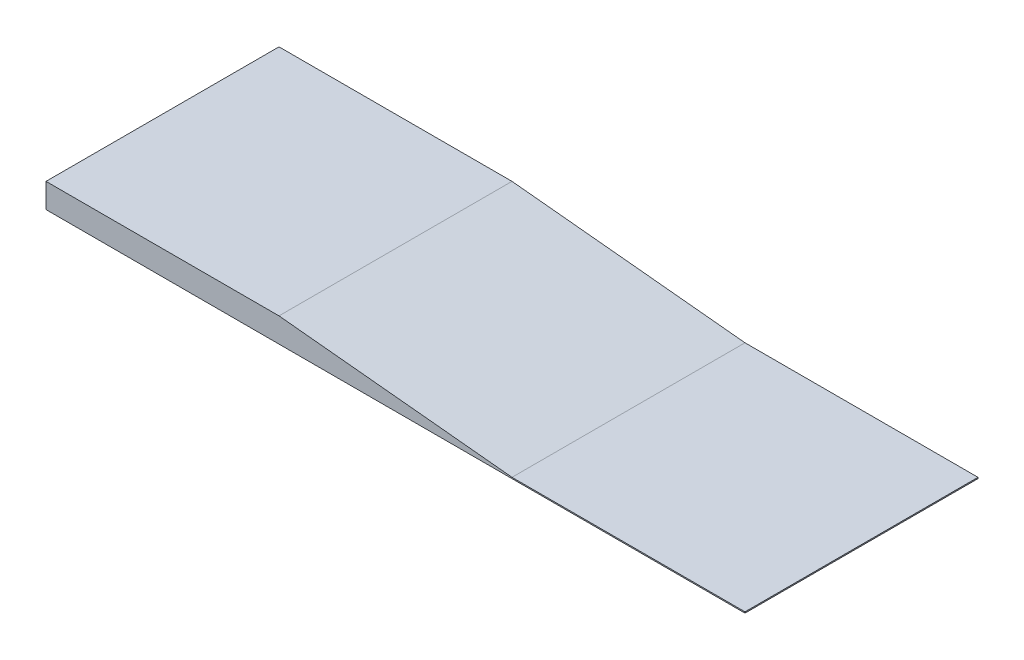
ISO-10303-21;
HEADER;
FILE_DESCRIPTION(('STEP AP214'),'2;1');
FILE_NAME('part.step','',(''),(''),'','','');
FILE_SCHEMA(('AUTOMOTIVE_DESIGN { 1 0 10303 214 1 1 1 1 }'));
ENDSEC;
DATA;
#1=APPLICATION_CONTEXT('core data for automotive mechanical design processes');
#2=APPLICATION_PROTOCOL_DEFINITION('international standard','automotive_design',2000,#1);
#3=PRODUCT_CONTEXT('',#1,'mechanical');
#4=PRODUCT('Part','Part','',(#3));
#5=PRODUCT_RELATED_PRODUCT_CATEGORY('part','',(#4));
#6=PRODUCT_DEFINITION_FORMATION('','',#4);
#7=PRODUCT_DEFINITION_CONTEXT('part definition',#1,'design');
#8=PRODUCT_DEFINITION('design','',#6,#7);
#9=PRODUCT_DEFINITION_SHAPE('','',#8);
#10=(LENGTH_UNIT() NAMED_UNIT(*) SI_UNIT(.MILLI.,.METRE.));
#11=(NAMED_UNIT(*) PLANE_ANGLE_UNIT() SI_UNIT($,.RADIAN.));
#12=(NAMED_UNIT(*) SI_UNIT($,.STERADIAN.) SOLID_ANGLE_UNIT());
#13=UNCERTAINTY_MEASURE_WITH_UNIT(LENGTH_MEASURE(1.E-05),#10,'distance_accuracy_value','');
#14=(GEOMETRIC_REPRESENTATION_CONTEXT(3) GLOBAL_UNCERTAINTY_ASSIGNED_CONTEXT((#13)) GLOBAL_UNIT_ASSIGNED_CONTEXT((#10,
#11,#12)) REPRESENTATION_CONTEXT('',''));
#15=CARTESIAN_POINT('',(0.,0.,0.));
#16=DIRECTION('',(0.,0.,1.));
#17=DIRECTION('',(1.,0.,0.));
#18=AXIS2_PLACEMENT_3D('',#15,#16,#17);
#19=CARTESIAN_POINT('',(0.,0.,2000.));
#20=DIRECTION('',(0.,-1.,0.));
#21=DIRECTION('',(1.,0.,0.));
#22=AXIS2_PLACEMENT_3D('',#19,#20,#21);
#23=PLANE('',#22);
#24=DIRECTION('',(-1.,0.,0.));
#25=VECTOR('',#24,1.);
#26=CARTESIAN_POINT('',(0.,0.,0.));
#27=LINE('',#26,#25);
#28=CARTESIAN_POINT('',(0.,0.,0.));
#29=VERTEX_POINT('',#28);
#30=CARTESIAN_POINT('',(-2000.,-2.44929359829471E-13,0.));
#31=VERTEX_POINT('',#30);
#32=EDGE_CURVE('E121',#29,#31,#27,.T.);
#33=ORIENTED_EDGE('',*,*,#32,.T.);
#34=DIRECTION('',(0.,0.,-1.));
#35=VECTOR('',#34,1.);
#36=CARTESIAN_POINT('',(-2000.,-2.44929359829471E-13,2000.));
#37=LINE('',#36,#35);
#38=CARTESIAN_POINT('',(-2000.,-2.44929359829471E-13,2000.));
#39=VERTEX_POINT('',#38);
#40=EDGE_CURVE('E11',#39,#31,#37,.T.);
#41=ORIENTED_EDGE('',*,*,#40,.F.);
#42=DIRECTION('',(-1.,0.,0.));
#43=VECTOR('',#42,1.);
#44=CARTESIAN_POINT('',(0.,0.,2000.));
#45=LINE('',#44,#43);
#46=CARTESIAN_POINT('',(0.,0.,2000.));
#47=VERTEX_POINT('',#46);
#48=EDGE_CURVE('E132',#47,#39,#45,.T.);
#49=ORIENTED_EDGE('',*,*,#48,.F.);
#50=DIRECTION('',(0.,0.,-1.));
#51=VECTOR('',#50,1.);
#52=CARTESIAN_POINT('',(0.,0.,2000.));
#53=LINE('',#52,#51);
#54=EDGE_CURVE('E117',#47,#29,#53,.T.);
#55=ORIENTED_EDGE('',*,*,#54,.T.);
#56=EDGE_LOOP('',(#33,#41,#49,#55));
#57=FACE_BOUND('',#56,.T.);
#58=ADVANCED_FACE('F37',(#57),#23,.F.);
#59=CARTESIAN_POINT('',(-2000.,-210.000000000001,2000.));
#60=DIRECTION('',(1.,0.,0.));
#61=DIRECTION('',(0.,0.,-1.));
#62=AXIS2_PLACEMENT_3D('',#59,#60,#61);
#63=PLANE('',#62);
#64=DIRECTION('',(0.,-1.,0.));
#65=VECTOR('',#64,1.);
#66=CARTESIAN_POINT('',(-2000.,-210.000000000001,0.));
#67=LINE('',#66,#65);
#68=CARTESIAN_POINT('',(-2000.,-210.000000000001,0.));
#69=VERTEX_POINT('',#68);
#70=EDGE_CURVE('E124',#31,#69,#67,.T.);
#71=ORIENTED_EDGE('',*,*,#70,.T.);
#72=DIRECTION('',(0.,0.,-1.));
#73=VECTOR('',#72,1.);
#74=CARTESIAN_POINT('',(-2000.,-210.000000000001,2000.));
#75=LINE('',#74,#73);
#76=CARTESIAN_POINT('',(-2000.,-210.000000000001,2000.));
#77=VERTEX_POINT('',#76);
#78=EDGE_CURVE('E45',#77,#69,#75,.T.);
#79=ORIENTED_EDGE('',*,*,#78,.F.);
#80=DIRECTION('',(0.,-1.,0.));
#81=VECTOR('',#80,1.);
#82=CARTESIAN_POINT('',(-2000.,-210.000000000001,2000.));
#83=LINE('',#82,#81);
#84=EDGE_CURVE('E90',#39,#77,#83,.T.);
#85=ORIENTED_EDGE('',*,*,#84,.F.);
#86=ORIENTED_EDGE('',*,*,#40,.T.);
#87=EDGE_LOOP('',(#71,#79,#85,#86));
#88=FACE_BOUND('',#87,.T.);
#89=ADVANCED_FACE('F138',(#88),#63,.F.);
#90=CARTESIAN_POINT('',(4000.,-210.,2000.));
#91=DIRECTION('',(0.,1.,0.));
#92=DIRECTION('',(-1.,0.,0.));
#93=AXIS2_PLACEMENT_3D('',#90,#91,#92);
#94=PLANE('',#93);
#95=DIRECTION('',(1.,0.,0.));
#96=VECTOR('',#95,1.);
#97=CARTESIAN_POINT('',(4000.,-210.,0.));
#98=LINE('',#97,#96);
#99=CARTESIAN_POINT('',(4000.,-210.,0.));
#100=VERTEX_POINT('',#99);
#101=EDGE_CURVE('E127',#69,#100,#98,.T.);
#102=ORIENTED_EDGE('',*,*,#101,.T.);
#103=DIRECTION('',(0.,0.,-1.));
#104=VECTOR('',#103,1.);
#105=CARTESIAN_POINT('',(4000.,-210.,2000.));
#106=LINE('',#105,#104);
#107=CARTESIAN_POINT('',(4000.,-210.,2000.));
#108=VERTEX_POINT('',#107);
#109=EDGE_CURVE('E112',#108,#100,#106,.T.);
#110=ORIENTED_EDGE('',*,*,#109,.F.);
#111=DIRECTION('',(1.,0.,0.));
#112=VECTOR('',#111,1.);
#113=CARTESIAN_POINT('',(0.,-210.,2000.));
#114=LINE('',#113,#112);
#115=EDGE_CURVE('E103',#77,#108,#114,.T.);
#116=ORIENTED_EDGE('',*,*,#115,.F.);
#117=ORIENTED_EDGE('',*,*,#78,.T.);
#118=EDGE_LOOP('',(#102,#110,#116,#117));
#119=FACE_BOUND('',#118,.T.);
#120=ADVANCED_FACE('F137',(#119),#94,.F.);
#121=CARTESIAN_POINT('',(4000.,-200.,2000.));
#122=DIRECTION('',(-1.,0.,0.));
#123=DIRECTION('',(0.,0.,1.));
#124=AXIS2_PLACEMENT_3D('',#121,#122,#123);
#125=PLANE('',#124);
#126=DIRECTION('',(0.,1.,0.));
#127=VECTOR('',#126,1.);
#128=CARTESIAN_POINT('',(4000.,-200.,0.));
#129=LINE('',#128,#127);
#130=CARTESIAN_POINT('',(4000.,-200.,0.));
#131=VERTEX_POINT('',#130);
#132=EDGE_CURVE('E111',#100,#131,#129,.T.);
#133=ORIENTED_EDGE('',*,*,#132,.T.);
#134=DIRECTION('',(0.,0.,-1.));
#135=VECTOR('',#134,1.);
#136=CARTESIAN_POINT('',(4000.,-200.,2000.));
#137=LINE('',#136,#135);
#138=CARTESIAN_POINT('',(4000.,-200.,2000.));
#139=VERTEX_POINT('',#138);
#140=EDGE_CURVE('E108',#139,#131,#137,.T.);
#141=ORIENTED_EDGE('',*,*,#140,.F.);
#142=DIRECTION('',(0.,1.,0.));
#143=VECTOR('',#142,1.);
#144=CARTESIAN_POINT('',(4000.,-200.,2000.));
#145=LINE('',#144,#143);
#146=EDGE_CURVE('E97',#108,#139,#145,.T.);
#147=ORIENTED_EDGE('',*,*,#146,.F.);
#148=ORIENTED_EDGE('',*,*,#109,.T.);
#149=EDGE_LOOP('',(#133,#141,#147,#148));
#150=FACE_BOUND('',#149,.T.);
#151=ADVANCED_FACE('F109',(#150),#125,.F.);
#152=CARTESIAN_POINT('',(2000.,-200.,2000.));
#153=DIRECTION('',(0.,-1.,0.));
#154=DIRECTION('',(0.,0.,-1.));
#155=AXIS2_PLACEMENT_3D('',#152,#153,#154);
#156=PLANE('',#155);
#157=DIRECTION('',(-1.,0.,0.));
#158=VECTOR('',#157,1.);
#159=CARTESIAN_POINT('',(2000.,-200.,0.));
#160=LINE('',#159,#158);
#161=CARTESIAN_POINT('',(2000.,-200.,0.));
#162=VERTEX_POINT('',#161);
#163=EDGE_CURVE('E76',#131,#162,#160,.T.);
#164=ORIENTED_EDGE('',*,*,#163,.T.);
#165=DIRECTION('',(0.,0.,-1.));
#166=VECTOR('',#165,1.);
#167=CARTESIAN_POINT('',(2000.,-200.,2000.));
#168=LINE('',#167,#166);
#169=CARTESIAN_POINT('',(2000.,-200.,2000.));
#170=VERTEX_POINT('',#169);
#171=EDGE_CURVE('E113',#170,#162,#168,.T.);
#172=ORIENTED_EDGE('',*,*,#171,.F.);
#173=DIRECTION('',(-1.,0.,0.));
#174=VECTOR('',#173,1.);
#175=CARTESIAN_POINT('',(2000.,-200.,2000.));
#176=LINE('',#175,#174);
#177=EDGE_CURVE('E101',#139,#170,#176,.T.);
#178=ORIENTED_EDGE('',*,*,#177,.F.);
#179=ORIENTED_EDGE('',*,*,#140,.T.);
#180=EDGE_LOOP('',(#164,#172,#178,#179));
#181=FACE_BOUND('',#180,.T.);
#182=ADVANCED_FACE('F115',(#181),#156,.F.);
#183=CARTESIAN_POINT('',(0.,0.,2000.));
#184=DIRECTION('',(-0.0995037190209988,-0.995037190209989,0.));
#185=DIRECTION('',(0.995037190209989,-0.0995037190209988,0.));
#186=AXIS2_PLACEMENT_3D('',#183,#184,#185);
#187=PLANE('',#186);
#188=DIRECTION('',(-0.995037190209989,0.0995037190209988,0.));
#189=VECTOR('',#188,1.);
#190=CARTESIAN_POINT('',(0.,0.,0.));
#191=LINE('',#190,#189);
#192=EDGE_CURVE('E82',#162,#29,#191,.T.);
#193=ORIENTED_EDGE('',*,*,#192,.T.);
#194=ORIENTED_EDGE('',*,*,#54,.F.);
#195=DIRECTION('',(-0.995037190209989,0.0995037190209988,0.));
#196=VECTOR('',#195,1.);
#197=CARTESIAN_POINT('',(0.,0.,2000.));
#198=LINE('',#197,#196);
#199=EDGE_CURVE('E53',#170,#47,#198,.T.);
#200=ORIENTED_EDGE('',*,*,#199,.F.);
#201=ORIENTED_EDGE('',*,*,#171,.T.);
#202=EDGE_LOOP('',(#193,#194,#200,#201));
#203=FACE_BOUND('',#202,.T.);
#204=ADVANCED_FACE('F145',(#203),#187,.F.);
#205=CARTESIAN_POINT('',(0.,0.,2000.));
#206=DIRECTION('',(0.,0.,-1.));
#207=DIRECTION('',(-1.,0.,0.));
#208=AXIS2_PLACEMENT_3D('',#205,#206,#207);
#209=PLANE('',#208);
#210=ORIENTED_EDGE('',*,*,#48,.T.);
#211=ORIENTED_EDGE('',*,*,#84,.T.);
#212=ORIENTED_EDGE('',*,*,#115,.T.);
#213=ORIENTED_EDGE('',*,*,#146,.T.);
#214=ORIENTED_EDGE('',*,*,#177,.T.);
#215=ORIENTED_EDGE('',*,*,#199,.T.);
#216=EDGE_LOOP('',(#210,#211,#212,#213,#214,#215));
#217=FACE_BOUND('',#216,.T.);
#218=ADVANCED_FACE('F99',(#217),#209,.F.);
#219=CARTESIAN_POINT('',(0.,0.,0.));
#220=DIRECTION('',(0.,0.,-1.));
#221=DIRECTION('',(-1.,0.,0.));
#222=AXIS2_PLACEMENT_3D('',#219,#220,#221);
#223=PLANE('',#222);
#224=ORIENTED_EDGE('',*,*,#32,.F.);
#225=ORIENTED_EDGE('',*,*,#192,.F.);
#226=ORIENTED_EDGE('',*,*,#163,.F.);
#227=ORIENTED_EDGE('',*,*,#132,.F.);
#228=ORIENTED_EDGE('',*,*,#101,.F.);
#229=ORIENTED_EDGE('',*,*,#70,.F.);
#230=EDGE_LOOP('',(#224,#225,#226,#227,#228,#229));
#231=FACE_BOUND('',#230,.T.);
#232=ADVANCED_FACE('F142',(#231),#223,.T.);
#233=CLOSED_SHELL('',(#58,#89,#120,#151,#182,#204,#218,#232));
#234=MANIFOLD_SOLID_BREP('B2',#233);
#235=ADVANCED_BREP_SHAPE_REPRESENTATION('',(#18,#234),#14);
#236=SHAPE_DEFINITION_REPRESENTATION(#9,#235);
ENDSEC;
END-ISO-10303-21;
